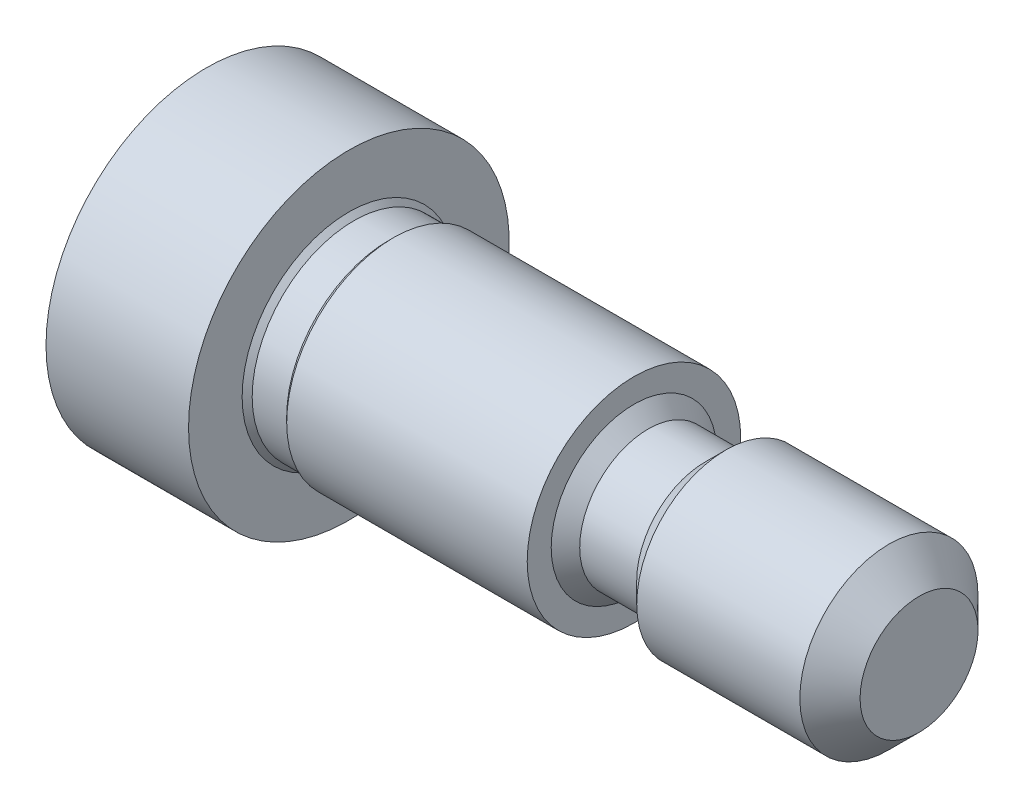
ISO-10303-21;
HEADER;
FILE_DESCRIPTION(('STEP AP214'),'2;1');
FILE_NAME('part.step','',(''),(''),'','','');
FILE_SCHEMA(('AUTOMOTIVE_DESIGN { 1 0 10303 214 1 1 1 1 }'));
ENDSEC;
DATA;
#1=APPLICATION_CONTEXT('core data for automotive mechanical design processes');
#2=APPLICATION_PROTOCOL_DEFINITION('international standard','automotive_design',2000,#1);
#3=PRODUCT_CONTEXT('',#1,'mechanical');
#4=PRODUCT('Part','Part','',(#3));
#5=PRODUCT_RELATED_PRODUCT_CATEGORY('part','',(#4));
#6=PRODUCT_DEFINITION_FORMATION('','',#4);
#7=PRODUCT_DEFINITION_CONTEXT('part definition',#1,'design');
#8=PRODUCT_DEFINITION('design','',#6,#7);
#9=PRODUCT_DEFINITION_SHAPE('','',#8);
#10=(LENGTH_UNIT() NAMED_UNIT(*) SI_UNIT(.MILLI.,.METRE.));
#11=(NAMED_UNIT(*) PLANE_ANGLE_UNIT() SI_UNIT($,.RADIAN.));
#12=(NAMED_UNIT(*) SI_UNIT($,.STERADIAN.) SOLID_ANGLE_UNIT());
#13=UNCERTAINTY_MEASURE_WITH_UNIT(LENGTH_MEASURE(1.E-05),#10,'distance_accuracy_value','');
#14=(GEOMETRIC_REPRESENTATION_CONTEXT(3) GLOBAL_UNCERTAINTY_ASSIGNED_CONTEXT((#13)) GLOBAL_UNIT_ASSIGNED_CONTEXT((#10,
#11,#12)) REPRESENTATION_CONTEXT('',''));
#15=CARTESIAN_POINT('',(0.,0.,0.));
#16=DIRECTION('',(0.,0.,1.));
#17=DIRECTION('',(1.,0.,0.));
#18=AXIS2_PLACEMENT_3D('',#15,#16,#17);
#19=CARTESIAN_POINT('',(0.,0.,-9.));
#20=DIRECTION('',(-1.,0.,0.));
#21=DIRECTION('',(0.,0.,1.));
#22=AXIS2_PLACEMENT_3D('',#19,#20,#21);
#23=PLANE('',#22);
#24=CARTESIAN_POINT('',(0.,0.,0.));
#25=DIRECTION('',(-1.,0.,0.));
#26=DIRECTION('',(0.,0.,1.));
#27=AXIS2_PLACEMENT_3D('',#24,#25,#26);
#28=CIRCLE('',#27,9.);
#29=CARTESIAN_POINT('',(0.,0.,9.));
#30=VERTEX_POINT('',#29);
#31=EDGE_CURVE('E11',#30,#30,#28,.T.);
#32=ORIENTED_EDGE('',*,*,#31,.F.);
#33=EDGE_LOOP('',(#32));
#34=FACE_BOUND('',#33,.T.);
#35=CARTESIAN_POINT('',(0.,0.,0.));
#36=DIRECTION('',(-1.,0.,0.));
#37=DIRECTION('',(0.,0.,1.));
#38=AXIS2_PLACEMENT_3D('',#35,#36,#37);
#39=CIRCLE('',#38,5.992);
#40=CARTESIAN_POINT('',(0.,0.,5.992));
#41=VERTEX_POINT('',#40);
#42=EDGE_CURVE('E137',#41,#41,#39,.T.);
#43=ORIENTED_EDGE('',*,*,#42,.T.);
#44=EDGE_LOOP('',(#43));
#45=FACE_BOUND('',#44,.T.);
#46=ADVANCED_FACE('F36',(#34,#45),#23,.F.);
#47=CARTESIAN_POINT('',(-8.,0.,0.));
#48=DIRECTION('',(-1.,0.,0.));
#49=DIRECTION('',(0.,0.,1.));
#50=AXIS2_PLACEMENT_3D('',#47,#48,#49);
#51=CYLINDRICAL_SURFACE('',#50,9.);
#52=CARTESIAN_POINT('',(-8.,0.,0.));
#53=DIRECTION('',(-1.,0.,0.));
#54=DIRECTION('',(0.,0.,1.));
#55=AXIS2_PLACEMENT_3D('',#52,#53,#54);
#56=CIRCLE('',#55,9.);
#57=CARTESIAN_POINT('',(-8.,0.,9.));
#58=VERTEX_POINT('',#57);
#59=EDGE_CURVE('E43',#58,#58,#56,.T.);
#60=ORIENTED_EDGE('',*,*,#59,.F.);
#61=EDGE_LOOP('',(#60));
#62=FACE_BOUND('',#61,.T.);
#63=ORIENTED_EDGE('',*,*,#31,.T.);
#64=EDGE_LOOP('',(#63));
#65=FACE_BOUND('',#64,.T.);
#66=ADVANCED_FACE('F179',(#62,#65),#51,.T.);
#67=CARTESIAN_POINT('',(-8.,0.,-9.));
#68=DIRECTION('',(1.,0.,0.));
#69=DIRECTION('',(0.,0.,-1.));
#70=AXIS2_PLACEMENT_3D('',#67,#68,#69);
#71=PLANE('',#70);
#72=DIRECTION('',(0.,0.866025403784438,-0.5));
#73=VECTOR('',#72,1.);
#74=CARTESIAN_POINT('',(-8.,0.,3.51894989071077));
#75=LINE('',#74,#73);
#76=CARTESIAN_POINT('',(-8.,0.,3.51894989071077));
#77=VERTEX_POINT('',#76);
#78=CARTESIAN_POINT('',(-8.,3.0475,1.75947494535538));
#79=VERTEX_POINT('',#78);
#80=EDGE_CURVE('E124',#77,#79,#75,.T.);
#81=ORIENTED_EDGE('',*,*,#80,.F.);
#82=DIRECTION('',(0.,0.866025403784439,0.499999999999999));
#83=VECTOR('',#82,1.);
#84=CARTESIAN_POINT('',(-8.,-3.0475,1.75947494535539));
#85=LINE('',#84,#83);
#86=CARTESIAN_POINT('',(-8.,-3.0475,1.75947494535539));
#87=VERTEX_POINT('',#86);
#88=EDGE_CURVE('E50',#87,#77,#85,.T.);
#89=ORIENTED_EDGE('',*,*,#88,.F.);
#90=DIRECTION('',(0.,0.,1.));
#91=VECTOR('',#90,1.);
#92=CARTESIAN_POINT('',(-8.,-3.0475,-1.75947494535538));
#93=LINE('',#92,#91);
#94=CARTESIAN_POINT('',(-8.,-3.0475,-1.75947494535538));
#95=VERTEX_POINT('',#94);
#96=EDGE_CURVE('E133',#95,#87,#93,.T.);
#97=ORIENTED_EDGE('',*,*,#96,.F.);
#98=DIRECTION('',(0.,-0.866025403784438,0.5));
#99=VECTOR('',#98,1.);
#100=CARTESIAN_POINT('',(-8.,0.,-3.51894989071077));
#101=LINE('',#100,#99);
#102=CARTESIAN_POINT('',(-8.,0.,-3.51894989071077));
#103=VERTEX_POINT('',#102);
#104=EDGE_CURVE('E131',#103,#95,#101,.T.);
#105=ORIENTED_EDGE('',*,*,#104,.F.);
#106=DIRECTION('',(0.,-0.866025403784439,-0.5));
#107=VECTOR('',#106,1.);
#108=CARTESIAN_POINT('',(-8.,3.0475,-1.75947494535539));
#109=LINE('',#108,#107);
#110=CARTESIAN_POINT('',(-8.,3.0475,-1.75947494535539));
#111=VERTEX_POINT('',#110);
#112=EDGE_CURVE('E98',#111,#103,#109,.T.);
#113=ORIENTED_EDGE('',*,*,#112,.F.);
#114=DIRECTION('',(0.,0.,-1.));
#115=VECTOR('',#114,1.);
#116=CARTESIAN_POINT('',(-8.,3.0475,1.75947494535538));
#117=LINE('',#116,#115);
#118=EDGE_CURVE('E127',#79,#111,#117,.T.);
#119=ORIENTED_EDGE('',*,*,#118,.F.);
#120=EDGE_LOOP('',(#81,#89,#97,#105,#113,#119));
#121=FACE_BOUND('',#120,.T.);
#122=ORIENTED_EDGE('',*,*,#59,.T.);
#123=EDGE_LOOP('',(#122));
#124=FACE_BOUND('',#123,.T.);
#125=ADVANCED_FACE('F177',(#121,#124),#71,.F.);
#126=CARTESIAN_POINT('',(32.,0.,-3.3095));
#127=DIRECTION('',(-1.,0.,0.));
#128=DIRECTION('',(0.,0.,1.));
#129=AXIS2_PLACEMENT_3D('',#126,#127,#128);
#130=PLANE('',#129);
#131=CARTESIAN_POINT('',(32.,0.,0.));
#132=DIRECTION('',(-1.,0.,0.));
#133=DIRECTION('',(0.,0.,1.));
#134=AXIS2_PLACEMENT_3D('',#131,#132,#133);
#135=CIRCLE('',#134,3.3095);
#136=CARTESIAN_POINT('',(32.,0.,3.3095));
#137=VERTEX_POINT('',#136);
#138=EDGE_CURVE('E172',#137,#137,#135,.T.);
#139=ORIENTED_EDGE('',*,*,#138,.F.);
#140=EDGE_LOOP('',(#139));
#141=FACE_BOUND('',#140,.T.);
#142=ADVANCED_FACE('F246',(#141),#130,.F.);
#143=CARTESIAN_POINT('',(32.,0.,0.));
#144=DIRECTION('',(-1.,0.,0.));
#145=DIRECTION('',(0.,0.,1.));
#146=AXIS2_PLACEMENT_3D('',#143,#144,#145);
#147=CONICAL_SURFACE('',#146,3.3095,0.785398163397447);
#148=CARTESIAN_POINT('',(30.3095,0.,0.));
#149=DIRECTION('',(-1.,0.,0.));
#150=DIRECTION('',(0.,0.,1.));
#151=AXIS2_PLACEMENT_3D('',#148,#149,#150);
#152=CIRCLE('',#151,5.);
#153=CARTESIAN_POINT('',(30.3095,0.,5.));
#154=VERTEX_POINT('',#153);
#155=EDGE_CURVE('E169',#154,#154,#152,.T.);
#156=ORIENTED_EDGE('',*,*,#155,.F.);
#157=EDGE_LOOP('',(#156));
#158=FACE_BOUND('',#157,.T.);
#159=ORIENTED_EDGE('',*,*,#138,.T.);
#160=EDGE_LOOP('',(#159));
#161=FACE_BOUND('',#160,.T.);
#162=ADVANCED_FACE('F240',(#158,#161),#147,.T.);
#163=CARTESIAN_POINT('',(-8.,0.,0.));
#164=DIRECTION('',(-1.,0.,0.));
#165=DIRECTION('',(0.,0.,1.));
#166=AXIS2_PLACEMENT_3D('',#163,#164,#165);
#167=CYLINDRICAL_SURFACE('',#166,5.);
#168=CARTESIAN_POINT('',(21.155,0.,0.));
#169=DIRECTION('',(-1.,0.,0.));
#170=DIRECTION('',(0.,0.,1.));
#171=AXIS2_PLACEMENT_3D('',#168,#169,#170);
#172=CIRCLE('',#171,5.);
#173=CARTESIAN_POINT('',(21.155,0.,5.));
#174=VERTEX_POINT('',#173);
#175=EDGE_CURVE('E166',#174,#174,#172,.T.);
#176=ORIENTED_EDGE('',*,*,#175,.F.);
#177=EDGE_LOOP('',(#176));
#178=FACE_BOUND('',#177,.T.);
#179=ORIENTED_EDGE('',*,*,#155,.T.);
#180=EDGE_LOOP('',(#179));
#181=FACE_BOUND('',#180,.T.);
#182=ADVANCED_FACE('F234',(#178,#181),#167,.T.);
#183=CARTESIAN_POINT('',(21.155,0.,0.));
#184=DIRECTION('',(1.,0.,0.));
#185=DIRECTION('',(0.,0.,-1.));
#186=AXIS2_PLACEMENT_3D('',#183,#184,#185);
#187=CONICAL_SURFACE('',#186,5.,0.78539816339745);
#188=CARTESIAN_POINT('',(20.,0.,0.));
#189=DIRECTION('',(-1.,0.,0.));
#190=DIRECTION('',(0.,0.,1.));
#191=AXIS2_PLACEMENT_3D('',#188,#189,#190);
#192=CIRCLE('',#191,3.845);
#193=CARTESIAN_POINT('',(20.,0.,3.845));
#194=VERTEX_POINT('',#193);
#195=EDGE_CURVE('E163',#194,#194,#192,.T.);
#196=ORIENTED_EDGE('',*,*,#195,.F.);
#197=EDGE_LOOP('',(#196));
#198=FACE_BOUND('',#197,.T.);
#199=ORIENTED_EDGE('',*,*,#175,.T.);
#200=EDGE_LOOP('',(#199));
#201=FACE_BOUND('',#200,.T.);
#202=ADVANCED_FACE('F228',(#198,#201),#187,.T.);
#203=CARTESIAN_POINT('',(-8.,0.,0.));
#204=DIRECTION('',(-1.,0.,0.));
#205=DIRECTION('',(0.,0.,1.));
#206=AXIS2_PLACEMENT_3D('',#203,#204,#205);
#207=CYLINDRICAL_SURFACE('',#206,3.845);
#208=CARTESIAN_POINT('',(16.8,0.,0.));
#209=DIRECTION('',(-1.,0.,0.));
#210=DIRECTION('',(0.,0.,1.));
#211=AXIS2_PLACEMENT_3D('',#208,#209,#210);
#212=CIRCLE('',#211,3.845);
#213=CARTESIAN_POINT('',(16.8,0.,3.845));
#214=VERTEX_POINT('',#213);
#215=EDGE_CURVE('E160',#214,#214,#212,.T.);
#216=ORIENTED_EDGE('',*,*,#215,.F.);
#217=EDGE_LOOP('',(#216));
#218=FACE_BOUND('',#217,.T.);
#219=ORIENTED_EDGE('',*,*,#195,.T.);
#220=EDGE_LOOP('',(#219));
#221=FACE_BOUND('',#220,.T.);
#222=ADVANCED_FACE('F222',(#218,#221),#207,.T.);
#223=CARTESIAN_POINT('',(16.8,0.,0.));
#224=DIRECTION('',(-1.,0.,0.));
#225=DIRECTION('',(0.,0.,1.));
#226=AXIS2_PLACEMENT_3D('',#223,#224,#225);
#227=CONICAL_SURFACE('',#226,3.845,0.785398163397445);
#228=CARTESIAN_POINT('',(16.,0.,0.));
#229=DIRECTION('',(-1.,0.,0.));
#230=DIRECTION('',(0.,0.,1.));
#231=AXIS2_PLACEMENT_3D('',#228,#229,#230);
#232=CIRCLE('',#231,4.64499999999999);
#233=CARTESIAN_POINT('',(16.,0.,4.64499999999999));
#234=VERTEX_POINT('',#233);
#235=EDGE_CURVE('E157',#234,#234,#232,.T.);
#236=ORIENTED_EDGE('',*,*,#235,.F.);
#237=EDGE_LOOP('',(#236));
#238=FACE_BOUND('',#237,.T.);
#239=ORIENTED_EDGE('',*,*,#215,.T.);
#240=EDGE_LOOP('',(#239));
#241=FACE_BOUND('',#240,.T.);
#242=ADVANCED_FACE('F216',(#238,#241),#227,.T.);
#243=CARTESIAN_POINT('',(16.,0.,-5.992));
#244=DIRECTION('',(-1.,0.,0.));
#245=DIRECTION('',(0.,0.,1.));
#246=AXIS2_PLACEMENT_3D('',#243,#244,#245);
#247=PLANE('',#246);
#248=CARTESIAN_POINT('',(16.,0.,0.));
#249=DIRECTION('',(-1.,0.,0.));
#250=DIRECTION('',(0.,0.,1.));
#251=AXIS2_PLACEMENT_3D('',#248,#249,#250);
#252=CIRCLE('',#251,5.992);
#253=CARTESIAN_POINT('',(16.,0.,5.992));
#254=VERTEX_POINT('',#253);
#255=EDGE_CURVE('E154',#254,#254,#252,.T.);
#256=ORIENTED_EDGE('',*,*,#255,.F.);
#257=EDGE_LOOP('',(#256));
#258=FACE_BOUND('',#257,.T.);
#259=ORIENTED_EDGE('',*,*,#235,.T.);
#260=EDGE_LOOP('',(#259));
#261=FACE_BOUND('',#260,.T.);
#262=ADVANCED_FACE('F210',(#258,#261),#247,.F.);
#263=CARTESIAN_POINT('',(-8.,0.,0.));
#264=DIRECTION('',(-1.,0.,0.));
#265=DIRECTION('',(0.,0.,1.));
#266=AXIS2_PLACEMENT_3D('',#263,#264,#265);
#267=CYLINDRICAL_SURFACE('',#266,5.992);
#268=CARTESIAN_POINT('',(2.5,0.,0.));
#269=DIRECTION('',(-1.,0.,0.));
#270=DIRECTION('',(0.,0.,1.));
#271=AXIS2_PLACEMENT_3D('',#268,#269,#270);
#272=CIRCLE('',#271,5.992);
#273=CARTESIAN_POINT('',(2.5,0.,5.992));
#274=VERTEX_POINT('',#273);
#275=EDGE_CURVE('E151',#274,#274,#272,.T.);
#276=ORIENTED_EDGE('',*,*,#275,.F.);
#277=EDGE_LOOP('',(#276));
#278=FACE_BOUND('',#277,.T.);
#279=ORIENTED_EDGE('',*,*,#255,.T.);
#280=EDGE_LOOP('',(#279));
#281=FACE_BOUND('',#280,.T.);
#282=ADVANCED_FACE('F204',(#278,#281),#267,.T.);
#283=CARTESIAN_POINT('',(2.5,0.,0.));
#284=DIRECTION('',(1.,0.,0.));
#285=DIRECTION('',(0.,0.,-1.));
#286=AXIS2_PLACEMENT_3D('',#283,#284,#285);
#287=CONICAL_SURFACE('',#286,5.992,0.78539816339745);
#288=CARTESIAN_POINT('',(2.218,0.,0.));
#289=DIRECTION('',(-1.,0.,0.));
#290=DIRECTION('',(0.,0.,1.));
#291=AXIS2_PLACEMENT_3D('',#288,#289,#290);
#292=CIRCLE('',#291,5.71);
#293=CARTESIAN_POINT('',(2.218,0.,5.71));
#294=VERTEX_POINT('',#293);
#295=EDGE_CURVE('E148',#294,#294,#292,.T.);
#296=ORIENTED_EDGE('',*,*,#295,.F.);
#297=EDGE_LOOP('',(#296));
#298=FACE_BOUND('',#297,.T.);
#299=ORIENTED_EDGE('',*,*,#275,.T.);
#300=EDGE_LOOP('',(#299));
#301=FACE_BOUND('',#300,.T.);
#302=ADVANCED_FACE('F198',(#298,#301),#287,.T.);
#303=CARTESIAN_POINT('',(-8.,0.,0.));
#304=DIRECTION('',(-1.,0.,0.));
#305=DIRECTION('',(0.,0.,1.));
#306=AXIS2_PLACEMENT_3D('',#303,#304,#305);
#307=CYLINDRICAL_SURFACE('',#306,5.71);
#308=CARTESIAN_POINT('',(0.282000000000001,0.,0.));
#309=DIRECTION('',(-1.,0.,0.));
#310=DIRECTION('',(0.,0.,1.));
#311=AXIS2_PLACEMENT_3D('',#308,#309,#310);
#312=CIRCLE('',#311,5.71);
#313=CARTESIAN_POINT('',(0.282000000000001,0.,5.71));
#314=VERTEX_POINT('',#313);
#315=EDGE_CURVE('E145',#314,#314,#312,.T.);
#316=ORIENTED_EDGE('',*,*,#315,.F.);
#317=EDGE_LOOP('',(#316));
#318=FACE_BOUND('',#317,.T.);
#319=ORIENTED_EDGE('',*,*,#295,.T.);
#320=EDGE_LOOP('',(#319));
#321=FACE_BOUND('',#320,.T.);
#322=ADVANCED_FACE('F192',(#318,#321),#307,.T.);
#323=CARTESIAN_POINT('',(0.282000000000001,0.,0.));
#324=DIRECTION('',(-1.,0.,0.));
#325=DIRECTION('',(0.,0.,1.));
#326=AXIS2_PLACEMENT_3D('',#323,#324,#325);
#327=CONICAL_SURFACE('',#326,5.71,0.785398163397447);
#328=ORIENTED_EDGE('',*,*,#42,.F.);
#329=EDGE_LOOP('',(#328));
#330=FACE_BOUND('',#329,.T.);
#331=ORIENTED_EDGE('',*,*,#315,.T.);
#332=EDGE_LOOP('',(#331));
#333=FACE_BOUND('',#332,.T.);
#334=ADVANCED_FACE('F188',(#330,#333),#327,.T.);
#335=CARTESIAN_POINT('',(-3.,-3.0475,1.75947494535539));
#336=DIRECTION('',(0.,-0.499999999999999,0.866025403784439));
#337=DIRECTION('',(0.,-0.866025403784439,-0.499999999999999));
#338=AXIS2_PLACEMENT_3D('',#335,#336,#337);
#339=PLANE('',#338);
#340=ORIENTED_EDGE('',*,*,#88,.T.);
#341=DIRECTION('',(-1.,0.,0.));
#342=VECTOR('',#341,1.);
#343=CARTESIAN_POINT('',(-3.,0.,3.51894989071077));
#344=LINE('',#343,#342);
#345=CARTESIAN_POINT('',(-3.,0.,3.51894989071077));
#346=VERTEX_POINT('',#345);
#347=EDGE_CURVE('E80',#346,#77,#344,.T.);
#348=ORIENTED_EDGE('',*,*,#347,.F.);
#349=DIRECTION('',(0.,0.866025403784439,0.499999999999999));
#350=VECTOR('',#349,1.);
#351=CARTESIAN_POINT('',(-3.,-3.0475,1.75947494535539));
#352=LINE('',#351,#350);
#353=CARTESIAN_POINT('',(-3.,-3.0475,1.75947494535539));
#354=VERTEX_POINT('',#353);
#355=EDGE_CURVE('E135',#354,#346,#352,.T.);
#356=ORIENTED_EDGE('',*,*,#355,.F.);
#357=DIRECTION('',(-1.,0.,0.));
#358=VECTOR('',#357,1.);
#359=CARTESIAN_POINT('',(-3.,-3.0475,1.75947494535539));
#360=LINE('',#359,#358);
#361=EDGE_CURVE('E58',#354,#87,#360,.T.);
#362=ORIENTED_EDGE('',*,*,#361,.T.);
#363=EDGE_LOOP('',(#340,#348,#356,#362));
#364=FACE_BOUND('',#363,.T.);
#365=ADVANCED_FACE('F191',(#364),#339,.F.);
#366=CARTESIAN_POINT('',(-3.,-3.0475,-1.75947494535538));
#367=DIRECTION('',(0.,-1.,0.));
#368=DIRECTION('',(0.,0.,-1.));
#369=AXIS2_PLACEMENT_3D('',#366,#367,#368);
#370=PLANE('',#369);
#371=ORIENTED_EDGE('',*,*,#96,.T.);
#372=ORIENTED_EDGE('',*,*,#361,.F.);
#373=DIRECTION('',(0.,0.,1.));
#374=VECTOR('',#373,1.);
#375=CARTESIAN_POINT('',(-3.,-3.0475,-1.75947494535538));
#376=LINE('',#375,#374);
#377=CARTESIAN_POINT('',(-3.,-3.0475,-1.75947494535538));
#378=VERTEX_POINT('',#377);
#379=EDGE_CURVE('E110',#378,#354,#376,.T.);
#380=ORIENTED_EDGE('',*,*,#379,.F.);
#381=DIRECTION('',(-1.,0.,0.));
#382=VECTOR('',#381,1.);
#383=CARTESIAN_POINT('',(-3.,-3.0475,-1.75947494535538));
#384=LINE('',#383,#382);
#385=EDGE_CURVE('E102',#378,#95,#384,.T.);
#386=ORIENTED_EDGE('',*,*,#385,.T.);
#387=EDGE_LOOP('',(#371,#372,#380,#386));
#388=FACE_BOUND('',#387,.T.);
#389=ADVANCED_FACE('F260',(#388),#370,.F.);
#390=CARTESIAN_POINT('',(-3.,0.,-3.51894989071077));
#391=DIRECTION('',(0.,-0.5,-0.866025403784438));
#392=DIRECTION('',(0.,0.866025403784438,-0.5));
#393=AXIS2_PLACEMENT_3D('',#390,#391,#392);
#394=PLANE('',#393);
#395=ORIENTED_EDGE('',*,*,#104,.T.);
#396=ORIENTED_EDGE('',*,*,#385,.F.);
#397=DIRECTION('',(0.,-0.866025403784438,0.5));
#398=VECTOR('',#397,1.);
#399=CARTESIAN_POINT('',(-3.,0.,-3.51894989071077));
#400=LINE('',#399,#398);
#401=CARTESIAN_POINT('',(-3.,0.,-3.51894989071077));
#402=VERTEX_POINT('',#401);
#403=EDGE_CURVE('E106',#402,#378,#400,.T.);
#404=ORIENTED_EDGE('',*,*,#403,.F.);
#405=DIRECTION('',(-1.,0.,0.));
#406=VECTOR('',#405,1.);
#407=CARTESIAN_POINT('',(-3.,0.,-3.51894989071077));
#408=LINE('',#407,#406);
#409=EDGE_CURVE('E91',#402,#103,#408,.T.);
#410=ORIENTED_EDGE('',*,*,#409,.T.);
#411=EDGE_LOOP('',(#395,#396,#404,#410));
#412=FACE_BOUND('',#411,.T.);
#413=ADVANCED_FACE('F107',(#412),#394,.F.);
#414=CARTESIAN_POINT('',(-3.,3.0475,-1.75947494535539));
#415=DIRECTION('',(0.,0.5,-0.866025403784439));
#416=DIRECTION('',(0.,0.866025403784439,0.5));
#417=AXIS2_PLACEMENT_3D('',#414,#415,#416);
#418=PLANE('',#417);
#419=ORIENTED_EDGE('',*,*,#112,.T.);
#420=ORIENTED_EDGE('',*,*,#409,.F.);
#421=DIRECTION('',(0.,-0.866025403784439,-0.5));
#422=VECTOR('',#421,1.);
#423=CARTESIAN_POINT('',(-3.,3.0475,-1.75947494535539));
#424=LINE('',#423,#422);
#425=CARTESIAN_POINT('',(-3.,3.0475,-1.75947494535539));
#426=VERTEX_POINT('',#425);
#427=EDGE_CURVE('E95',#426,#402,#424,.T.);
#428=ORIENTED_EDGE('',*,*,#427,.F.);
#429=DIRECTION('',(-1.,0.,0.));
#430=VECTOR('',#429,1.);
#431=CARTESIAN_POINT('',(-3.,3.0475,-1.75947494535539));
#432=LINE('',#431,#430);
#433=EDGE_CURVE('E103',#426,#111,#432,.T.);
#434=ORIENTED_EDGE('',*,*,#433,.T.);
#435=EDGE_LOOP('',(#419,#420,#428,#434));
#436=FACE_BOUND('',#435,.T.);
#437=ADVANCED_FACE('F93',(#436),#418,.F.);
#438=CARTESIAN_POINT('',(-3.,3.0475,1.75947494535538));
#439=DIRECTION('',(0.,1.,0.));
#440=DIRECTION('',(0.,0.,1.));
#441=AXIS2_PLACEMENT_3D('',#438,#439,#440);
#442=PLANE('',#441);
#443=ORIENTED_EDGE('',*,*,#118,.T.);
#444=ORIENTED_EDGE('',*,*,#433,.F.);
#445=DIRECTION('',(0.,0.,-1.));
#446=VECTOR('',#445,1.);
#447=CARTESIAN_POINT('',(-3.,3.0475,1.75947494535538));
#448=LINE('',#447,#446);
#449=CARTESIAN_POINT('',(-3.,3.0475,1.75947494535538));
#450=VERTEX_POINT('',#449);
#451=EDGE_CURVE('E116',#450,#426,#448,.T.);
#452=ORIENTED_EDGE('',*,*,#451,.F.);
#453=DIRECTION('',(-1.,0.,0.));
#454=VECTOR('',#453,1.);
#455=CARTESIAN_POINT('',(-3.,3.0475,1.75947494535538));
#456=LINE('',#455,#454);
#457=EDGE_CURVE('E140',#450,#79,#456,.T.);
#458=ORIENTED_EDGE('',*,*,#457,.T.);
#459=EDGE_LOOP('',(#443,#444,#452,#458));
#460=FACE_BOUND('',#459,.T.);
#461=ADVANCED_FACE('F264',(#460),#442,.F.);
#462=CARTESIAN_POINT('',(-3.,0.,3.51894989071077));
#463=DIRECTION('',(0.,0.5,0.866025403784438));
#464=DIRECTION('',(0.,-0.866025403784438,0.5));
#465=AXIS2_PLACEMENT_3D('',#462,#463,#464);
#466=PLANE('',#465);
#467=ORIENTED_EDGE('',*,*,#80,.T.);
#468=ORIENTED_EDGE('',*,*,#457,.F.);
#469=DIRECTION('',(0.,0.866025403784438,-0.5));
#470=VECTOR('',#469,1.);
#471=CARTESIAN_POINT('',(-3.,0.,3.51894989071077));
#472=LINE('',#471,#470);
#473=EDGE_CURVE('E118',#346,#450,#472,.T.);
#474=ORIENTED_EDGE('',*,*,#473,.F.);
#475=ORIENTED_EDGE('',*,*,#347,.T.);
#476=EDGE_LOOP('',(#467,#468,#474,#475));
#477=FACE_BOUND('',#476,.T.);
#478=ADVANCED_FACE('F261',(#477),#466,.F.);
#479=CARTESIAN_POINT('',(-3.,0.,3.51894989071077));
#480=DIRECTION('',(-1.,0.,0.));
#481=DIRECTION('',(0.,0.,1.));
#482=AXIS2_PLACEMENT_3D('',#479,#480,#481);
#483=PLANE('',#482);
#484=ORIENTED_EDGE('',*,*,#355,.T.);
#485=ORIENTED_EDGE('',*,*,#473,.T.);
#486=ORIENTED_EDGE('',*,*,#451,.T.);
#487=ORIENTED_EDGE('',*,*,#427,.T.);
#488=ORIENTED_EDGE('',*,*,#403,.T.);
#489=ORIENTED_EDGE('',*,*,#379,.T.);
#490=EDGE_LOOP('',(#484,#485,#486,#487,#488,#489));
#491=FACE_BOUND('',#490,.T.);
#492=ADVANCED_FACE('F113',(#491),#483,.T.);
#493=CLOSED_SHELL('',(#46,#66,#125,#142,#162,#182,#202,#222,#242,#262,#282,#302,#322,#334,#365,
#389,#413,#437,#461,#478,#492));
#494=MANIFOLD_SOLID_BREP('B2',#493);
#495=ADVANCED_BREP_SHAPE_REPRESENTATION('',(#18,#494),#14);
#496=SHAPE_DEFINITION_REPRESENTATION(#9,#495);
ENDSEC;
END-ISO-10303-21;
